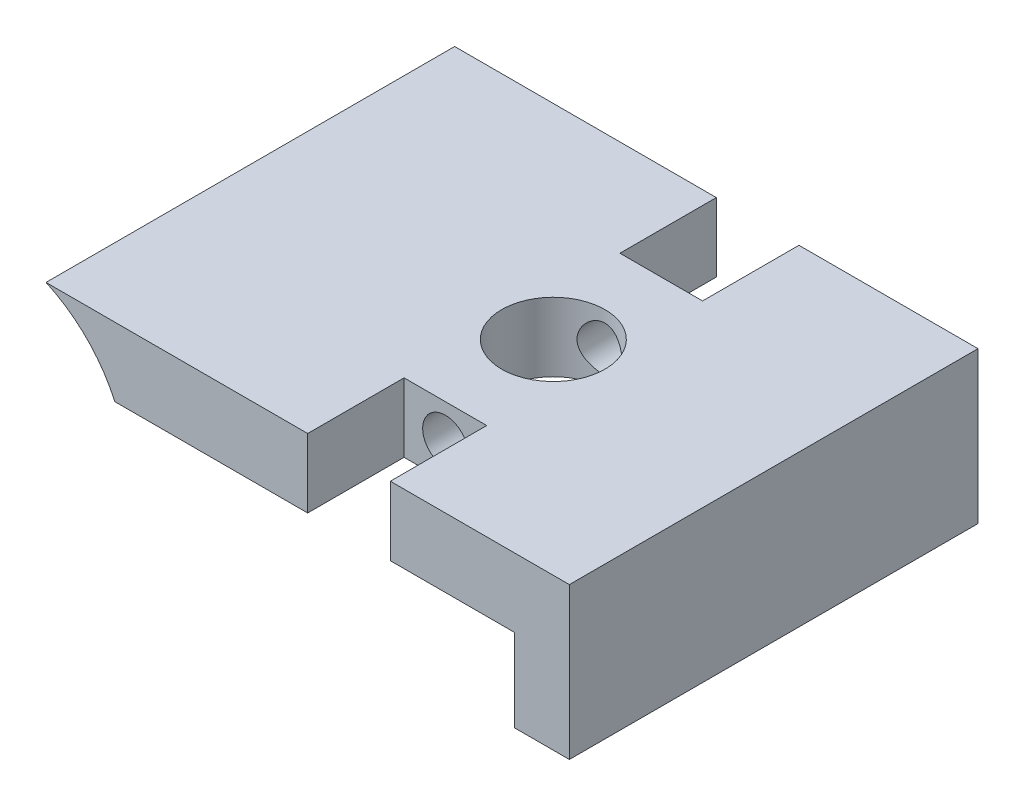
ISO-10303-21;
HEADER;
FILE_DESCRIPTION(('STEP AP214'),'2;1');
FILE_NAME('part.step','',(''),(''),'','','');
FILE_SCHEMA(('AUTOMOTIVE_DESIGN { 1 0 10303 214 1 1 1 1 }'));
ENDSEC;
DATA;
#1=APPLICATION_CONTEXT('core data for automotive mechanical design processes');
#2=APPLICATION_PROTOCOL_DEFINITION('international standard','automotive_design',2000,#1);
#3=PRODUCT_CONTEXT('',#1,'mechanical');
#4=PRODUCT('Part','Part','',(#3));
#5=PRODUCT_RELATED_PRODUCT_CATEGORY('part','',(#4));
#6=PRODUCT_DEFINITION_FORMATION('','',#4);
#7=PRODUCT_DEFINITION_CONTEXT('part definition',#1,'design');
#8=PRODUCT_DEFINITION('design','',#6,#7);
#9=PRODUCT_DEFINITION_SHAPE('','',#8);
#10=(LENGTH_UNIT() NAMED_UNIT(*) SI_UNIT(.MILLI.,.METRE.));
#11=(NAMED_UNIT(*) PLANE_ANGLE_UNIT() SI_UNIT($,.RADIAN.));
#12=(NAMED_UNIT(*) SI_UNIT($,.STERADIAN.) SOLID_ANGLE_UNIT());
#13=UNCERTAINTY_MEASURE_WITH_UNIT(LENGTH_MEASURE(1.E-05),#10,'distance_accuracy_value','');
#14=(GEOMETRIC_REPRESENTATION_CONTEXT(3) GLOBAL_UNCERTAINTY_ASSIGNED_CONTEXT((#13)) GLOBAL_UNIT_ASSIGNED_CONTEXT((#10,
#11,#12)) REPRESENTATION_CONTEXT('',''));
#15=CARTESIAN_POINT('',(0.,0.,0.));
#16=DIRECTION('',(0.,0.,1.));
#17=DIRECTION('',(1.,0.,0.));
#18=AXIS2_PLACEMENT_3D('',#15,#16,#17);
#19=CARTESIAN_POINT('',(3.,0.,-14.836));
#20=DIRECTION('',(0.,0.,1.));
#21=DIRECTION('',(1.,0.,0.));
#22=AXIS2_PLACEMENT_3D('',#19,#20,#21);
#23=CYLINDRICAL_SURFACE('',#22,1.65);
#24=CARTESIAN_POINT('',(4.65,0.,-3.36749164809655));
#25=CARTESIAN_POINT('',(4.64999591948725,-0.0874743691332474,-3.36749607292385));
#26=CARTESIAN_POINT('',(4.64299960015496,-0.175092773934513,-3.37094939684784));
#27=CARTESIAN_POINT('',(4.61531716545798,-0.34775711686567,-3.38429832583538));
#28=CARTESIAN_POINT('',(4.59459592274656,-0.432795867086391,-3.39421046041475));
#29=CARTESIAN_POINT('',(4.54044870220548,-0.597493099250677,-3.41912171212208));
#30=CARTESIAN_POINT('',(4.50707857419381,-0.677173445386291,-3.43409843617774));
#31=CARTESIAN_POINT('',(4.42874832845569,-0.829783884986517,-3.46741736925901));
#32=CARTESIAN_POINT('',(4.38379002894349,-0.902715034980066,-3.48575905018413));
#33=CARTESIAN_POINT('',(4.28021734567749,-1.04487154765316,-3.52516638479344));
#34=CARTESIAN_POINT('',(4.22091990046756,-1.11357209474115,-3.5463309106205));
#35=CARTESIAN_POINT('',(4.09178303274802,-1.240446840094,-3.5881911575404));
#36=CARTESIAN_POINT('',(4.02193928529622,-1.2986166981996,-3.60888668227713));
#37=CARTESIAN_POINT('',(3.86946484491626,-1.4055670834385,-3.64870271327509));
#38=CARTESIAN_POINT('',(3.78637319615618,-1.45374252984987,-3.66769507829857));
#39=CARTESIAN_POINT('',(3.61227632392994,-1.53520034882065,-3.700736202455));
#40=CARTESIAN_POINT('',(3.52127502438019,-1.56849005628031,-3.71478739560396));
#41=CARTESIAN_POINT('',(3.3394662745173,-1.61728382118505,-3.73565913311448));
#42=CARTESIAN_POINT('',(3.24894589824284,-1.63369687425849,-3.74284752867496));
#43=CARTESIAN_POINT('',(3.06617018053507,-1.65122350001049,-3.75052967187645));
#44=CARTESIAN_POINT('',(2.97391564874558,-1.65234404312535,-3.75102646959465));
#45=CARTESIAN_POINT('',(2.79695735459994,-1.63969762210197,-3.74547519866295));
#46=CARTESIAN_POINT('',(2.71216534970809,-1.62693375012661,-3.739868091581));
#47=CARTESIAN_POINT('',(2.5460705321449,-1.58862001141632,-3.72336083389609));
#48=CARTESIAN_POINT('',(2.46476797823857,-1.56306919822084,-3.71246029148675));
#49=CARTESIAN_POINT('',(2.30645273442336,-1.49962622377596,-3.68619520386884));
#50=CARTESIAN_POINT('',(2.22952453920683,-1.46155151512837,-3.67076501619212));
#51=CARTESIAN_POINT('',(2.08294686925941,-1.37433410623967,-3.63691910801703));
#52=CARTESIAN_POINT('',(2.01330005270581,-1.32518738450649,-3.6185023034251));
#53=CARTESIAN_POINT('',(1.87753504589473,-1.2128170119971,-3.57882020061428));
#54=CARTESIAN_POINT('',(1.81210572269681,-1.14879890575555,-3.5574447595915));
#55=CARTESIAN_POINT('',(1.69259260075723,-1.01070787762529,-3.51528240579217));
#56=CARTESIAN_POINT('',(1.63851423294623,-0.936630170451263,-3.49449577883282));
#57=CARTESIAN_POINT('',(1.54117220405855,-0.776800460066403,-3.45502479534648));
#58=CARTESIAN_POINT('',(1.49843008891747,-0.690699088400845,-3.43645839327868));
#59=CARTESIAN_POINT('',(1.42834028609234,-0.511490455495734,-3.40497856582965));
#60=CARTESIAN_POINT('',(1.40098013157646,-0.41838893735563,-3.39206056440346));
#61=CARTESIAN_POINT('',(1.36429227707905,-0.234744535363264,-3.37451456223478));
#62=CARTESIAN_POINT('',(1.35383875555708,-0.144476988157731,-3.36937064835985));
#63=CARTESIAN_POINT('',(1.34792333452705,0.0366498278836368,-3.3664757487194));
#64=CARTESIAN_POINT('',(1.35245516573099,0.127508833402344,-3.36872167133214));
#65=CARTESIAN_POINT('',(1.37535174013094,0.300038323378435,-3.37981562096985));
#66=CARTESIAN_POINT('',(1.39265374352297,0.381886932345066,-3.3881559621082));
#67=CARTESIAN_POINT('',(1.43914744636585,0.541431160999625,-3.40982287754369));
#68=CARTESIAN_POINT('',(1.46834214737761,0.619125726657321,-3.42315071054923));
#69=CARTESIAN_POINT('',(1.53921629690324,0.772027463841041,-3.45400682275722));
#70=CARTESIAN_POINT('',(1.58139272921155,0.846970827739317,-3.47169539316015));
#71=CARTESIAN_POINT('',(1.6765572613445,0.989101543315069,-3.50907546279441));
#72=CARTESIAN_POINT('',(1.72955038819797,1.05628526590526,-3.5287678911715));
#73=CARTESIAN_POINT('',(1.85062358980462,1.1874847750961,-3.57013856276202));
#74=CARTESIAN_POINT('',(1.9196470398001,1.25062896923802,-3.59183160476859));
#75=CARTESIAN_POINT('',(2.06778238636593,1.36462621623266,-3.63309467060809));
#76=CARTESIAN_POINT('',(2.14689558402023,1.41547768147164,-3.65266442003673));
#77=CARTESIAN_POINT('',(2.31400673932617,1.50362813045693,-3.68771558350776));
#78=CARTESIAN_POINT('',(2.40206664806587,1.54082304607771,-3.70316536765515));
#79=CARTESIAN_POINT('',(2.58405684732281,1.59956776607056,-3.72798894821772));
#80=CARTESIAN_POINT('',(2.6779831509097,1.62112807306507,-3.73736682301229));
#81=CARTESIAN_POINT('',(2.8612978165453,1.64656089333973,-3.74847245839303));
#82=CARTESIAN_POINT('',(2.95048512527525,1.65165818539735,-3.75072963755332));
#83=CARTESIAN_POINT('',(3.12843486064658,1.64739798838614,-3.74885512685435));
#84=CARTESIAN_POINT('',(3.21719737386056,1.63804358240264,-3.74472479968784));
#85=CARTESIAN_POINT('',(3.38782932587363,1.60602123171462,-3.7308324127445));
#86=CARTESIAN_POINT('',(3.46983114363675,1.58394115377816,-3.72131934376771));
#87=CARTESIAN_POINT('',(3.62890956243099,1.52777362465028,-3.69776205916142));
#88=CARTESIAN_POINT('',(3.70598528433432,1.49368403723099,-3.68371703743449));
#89=CARTESIAN_POINT('',(3.8569304617613,1.41274147649752,-3.65162935021383));
#90=CARTESIAN_POINT('',(3.93049119711801,1.3653752637279,-3.63343300227536));
#91=CARTESIAN_POINT('',(4.06894266820481,1.2599369507724,-3.59513976322225));
#92=CARTESIAN_POINT('',(4.13382977719906,1.20186039623366,-3.57504208305736));
#93=CARTESIAN_POINT('',(4.25831260974056,1.0713970399496,-3.53324031823005));
#94=CARTESIAN_POINT('',(4.31711532685678,0.998252385431571,-3.51153178279635));
#95=CARTESIAN_POINT('',(4.42177534917193,0.842529476107367,-3.47047923678989));
#96=CARTESIAN_POINT('',(4.46762474174624,0.759945498298501,-3.45113667556083));
#97=CARTESIAN_POINT('',(4.5449162136947,0.587124299309066,-3.41723991894322));
#98=CARTESIAN_POINT('',(4.57632700235197,0.496870953906528,-3.40269614232787));
#99=CARTESIAN_POINT('',(4.62309555077018,0.31164351772581,-3.38064338773551));
#100=CARTESIAN_POINT('',(4.6385071714776,0.216686400884627,-3.3731108155642));
#101=CARTESIAN_POINT('',(4.64703108329939,0.100998496777639,-3.36894448238601));
#102=CARTESIAN_POINT('',(4.64814335262455,0.0808209970433216,-3.36840080987488));
#103=CARTESIAN_POINT('',(4.64962829144477,0.0404315640214764,-3.3676738770119));
#104=CARTESIAN_POINT('',(4.65000094320723,0.02021962992,-3.36749062530128));
#105=CARTESIAN_POINT('',(4.65,0.,-3.36749164809655));
#106=B_SPLINE_CURVE_WITH_KNOTS('',3,(#24,#25,#26,#27,#28,#29,#30,#31,#32,#33,#34,#35,#36,#37,
#38,#39,#40,#41,#42,#43,#44,#45,#46,#47,#48,#49,#50,#51,#52,#53,#54,#55,#56,#57,#58,#59,#60,#61,
#62,#63,#64,#65,#66,#67,#68,#69,#70,#71,#72,#73,#74,#75,#76,#77,#78,#79,#80,#81,#82,#83,#84,#85,
#86,#87,#88,#89,#90,#91,#92,#93,#94,#95,#96,#97,#98,#99,#100,#101,#102,#103,#104,#105),
.UNSPECIFIED.,.T.,.F.,(4,2,2,2,2,2,2,2,2,2,2,2,2,2,2,2,2,2,2,2,2,2,2,2,2,2,2,2,2,2,2,2,2,2,2,2,
2,2,2,2,4),(0.,0.262337992001349,0.52535001551118,0.787214015160152,1.04903695265106,
1.32739302247777,1.60586355517072,1.89807751150631,2.19014732125288,2.46549872058573,
2.74072460857159,2.9973112845901,3.25391695538524,3.51444216606865,3.77506215572741,
4.05582705551463,4.33672598422601,4.62890596840992,4.92084880275994,5.1924046605751,
5.46384692437079,5.71493513596501,5.96608675823259,6.22839495294345,6.49082533337074,
6.77759301230099,7.06439770769602,7.35334470453729,7.64209741960136,7.90880391080322,
8.17545351143564,8.43067328899049,8.68593848747794,8.95289970595717,9.21997220307097,
9.50762420315226,9.79545153931286,10.0838997352209,10.371373694431,10.4320114560409,
10.4926506714452),.UNSPECIFIED.);
#107=CARTESIAN_POINT('',(4.65,0.,-3.36749164809655));
#108=VERTEX_POINT('',#107);
#109=EDGE_CURVE('E189',#108,#108,#106,.T.);
#110=ORIENTED_EDGE('',*,*,#109,.F.);
#111=EDGE_LOOP('',(#110));
#112=FACE_BOUND('',#111,.T.);
#113=CARTESIAN_POINT('',(3.,0.,-7.835));
#114=DIRECTION('',(0.,0.,1.));
#115=DIRECTION('',(1.,0.,0.));
#116=AXIS2_PLACEMENT_3D('',#113,#114,#115);
#117=CIRCLE('',#116,1.65);
#118=CARTESIAN_POINT('',(4.65,0.,-7.835));
#119=VERTEX_POINT('',#118);
#120=EDGE_CURVE('E522',#119,#119,#117,.T.);
#121=ORIENTED_EDGE('',*,*,#120,.F.);
#122=EDGE_LOOP('',(#121));
#123=FACE_BOUND('',#122,.T.);
#124=ADVANCED_FACE('F45',(#112,#123),#23,.F.);
#125=CARTESIAN_POINT('',(3.,-1.65,3.75));
#126=CARTESIAN_POINT('',(3.08794065243915,-1.64999603822561,3.74999677525689));
#127=CARTESIAN_POINT('',(3.17602118872722,-1.64292811014754,3.7468719189208));
#128=CARTESIAN_POINT('',(3.34965330491862,-1.61493414299233,3.734683166008));
#129=CARTESIAN_POINT('',(3.43519818666942,-1.59397431770864,3.72560479056562));
#130=CARTESIAN_POINT('',(3.60097235797527,-1.5391312845056,3.70247374212791));
#131=CARTESIAN_POINT('',(3.68121929706646,-1.505293822675,3.68843868963418));
#132=CARTESIAN_POINT('',(3.83481096834596,-1.42585820871192,3.65674015300381));
#133=CARTESIAN_POINT('',(3.90815735131846,-1.38026287916687,3.63907753990429));
#134=CARTESIAN_POINT('',(4.05000163649842,-1.27598104842036,3.60078615738986));
#135=CARTESIAN_POINT('',(4.11807366426439,-1.21675391782859,3.58005322837619));
#136=CARTESIAN_POINT('',(4.2436925761984,-1.08803679555134,3.53837779505836));
#137=CARTESIAN_POINT('',(4.30123331014303,-1.01854084946946,3.51743517577732));
#138=CARTESIAN_POINT('',(4.40737198125606,-0.866527492524002,3.47638120662905));
#139=CARTESIAN_POINT('',(4.45528386928224,-0.783497192018437,3.45638307676996));
#140=CARTESIAN_POINT('',(4.53627172599083,-0.609555260312117,3.4211597332649));
#141=CARTESIAN_POINT('',(4.56935619199839,-0.518648178890969,3.40593178742375));
#142=CARTESIAN_POINT('',(4.61794121689661,-0.336431274272992,3.3831135312385));
#143=CARTESIAN_POINT('',(4.63426566626132,-0.245387501455808,3.37516767353209));
#144=CARTESIAN_POINT('',(4.65143054751147,-0.0615333461945671,3.3668053594707));
#145=CARTESIAN_POINT('',(4.65228100759649,0.0312758530848424,3.36638402671406));
#146=CARTESIAN_POINT('',(4.63908919688508,0.207355873544219,3.3728210640382));
#147=CARTESIAN_POINT('',(4.6263414186449,0.290751689794494,3.37904671722602));
#148=CARTESIAN_POINT('',(4.58850520692875,0.454071225614267,3.39699646382114));
#149=CARTESIAN_POINT('',(4.56341407162607,0.533994180841886,3.40872176101459));
#150=CARTESIAN_POINT('',(4.50110649630305,0.690226926082278,3.43662073577462));
#151=CARTESIAN_POINT('',(4.46363227970243,0.766416489003947,3.45288773136686));
#152=CARTESIAN_POINT('',(4.37780710670809,0.911743878376031,3.48802159021638));
#153=CARTESIAN_POINT('',(4.32945161231713,0.980878745156235,3.50688953691531));
#154=CARTESIAN_POINT('',(4.21783776896922,1.1170679833526,3.54728261097474));
#155=CARTESIAN_POINT('',(4.15359849475329,1.18329659100235,3.56888963165699));
#156=CARTESIAN_POINT('',(4.01473808953318,1.30433611063186,3.61082599340459));
#157=CARTESIAN_POINT('',(3.94011395212262,1.35914370472459,3.63115496199219));
#158=CARTESIAN_POINT('',(3.7798454417349,1.45719190039968,3.66896451776513));
#159=CARTESIAN_POINT('',(3.69394811565676,1.50005943159355,3.68634771561839));
#160=CARTESIAN_POINT('',(3.51519989197508,1.57043908051859,3.71554130843415));
#161=CARTESIAN_POINT('',(3.42235333017466,1.59796068385571,3.72735514522372));
#162=CARTESIAN_POINT('',(3.23921022750968,1.63505304083377,3.74341295596741));
#163=CARTESIAN_POINT('',(3.14917854061997,1.64572966452197,3.74812228788192));
#164=CARTESIAN_POINT('',(2.96849247665595,1.65217171911425,3.75095455785044));
#165=CARTESIAN_POINT('',(2.87783831540075,1.64794208106068,3.74907967398628));
#166=CARTESIAN_POINT('',(2.70390665287527,1.62544881834208,3.73925037459651));
#167=CARTESIAN_POINT('',(2.62050230959726,1.60799437581934,3.73164663418775));
#168=CARTESIAN_POINT('',(2.45791706209694,1.56071027218963,3.71151728629914));
#169=CARTESIAN_POINT('',(2.37873667607145,1.53087909662229,3.69899107649862));
#170=CARTESIAN_POINT('',(2.22404079862632,1.45873229578337,3.66971134498956));
#171=CARTESIAN_POINT('',(2.14871703627142,1.41605581574277,3.65283800179973));
#172=CARTESIAN_POINT('',(2.00602810222664,1.31982329381418,3.61662102234894));
#173=CARTESIAN_POINT('',(1.93866640117435,1.26626253496257,3.5972763164179));
#174=CARTESIAN_POINT('',(1.80819611837274,1.14484038573232,3.55628214760163));
#175=CARTESIAN_POINT('',(1.74584598439285,1.07618271743489,3.53457144282308));
#176=CARTESIAN_POINT('',(1.63330445356359,0.929097206857131,3.49260064747062));
#177=CARTESIAN_POINT('',(1.58311709508679,0.850666132592151,3.47234104026915));
#178=CARTESIAN_POINT('',(1.49540307748589,0.683921591275962,3.43526035744154));
#179=CARTESIAN_POINT('',(1.45817723591055,0.595429542818637,3.4185241503665));
#180=CARTESIAN_POINT('',(1.39950438017547,0.412456963898668,3.39145640297362));
#181=CARTESIAN_POINT('',(1.37804232181517,0.31798223681692,3.38111875766089));
#182=CARTESIAN_POINT('',(1.35307874998712,0.134229339541118,3.36902436868046));
#183=CARTESIAN_POINT('',(1.34822601990919,0.0451768053067855,3.36662264808986));
#184=CARTESIAN_POINT('',(1.35292803694661,-0.132443324028021,3.36892598901368));
#185=CARTESIAN_POINT('',(1.36247987258739,-0.221011013494953,3.37362961438419));
#186=CARTESIAN_POINT('',(1.39454415171674,-0.389834130472385,3.38899632048545));
#187=CARTESIAN_POINT('',(1.41627535473376,-0.470274087988891,3.39929913530276));
#188=CARTESIAN_POINT('',(1.4712672768033,-0.626361280798593,3.42438089295876));
#189=CARTESIAN_POINT('',(1.50453131275969,-0.702007129869672,3.43916112337134));
#190=CARTESIAN_POINT('',(1.58406507679427,-0.851619735953305,3.47269356886383));
#191=CARTESIAN_POINT('',(1.63102681157857,-0.925174495154697,3.49163847278619));
#192=CARTESIAN_POINT('',(1.7357127896172,-1.06377992281056,3.53089238653571));
#193=CARTESIAN_POINT('',(1.79344141213049,-1.12882711256769,3.55120194925799));
#194=CARTESIAN_POINT('',(1.92382903951875,-1.25428003578287,3.59296880703805));
#195=CARTESIAN_POINT('',(1.99734015606778,-1.31382091586417,3.6143768693599));
#196=CARTESIAN_POINT('',(2.15406955877593,-1.41980560454866,3.65423468677977));
#197=CARTESIAN_POINT('',(2.23729223810855,-1.46624345307615,3.67268309400139));
#198=CARTESIAN_POINT('',(2.41023740744422,-1.54387701756614,3.70436408768263));
#199=CARTESIAN_POINT('',(2.49986734754799,-1.57525320509647,3.71765804406783));
#200=CARTESIAN_POINT('',(2.68371482188615,-1.62216171678277,3.73777368374933));
#201=CARTESIAN_POINT('',(2.77791736039553,-1.63774259010252,3.74461519501638));
#202=CARTESIAN_POINT('',(2.89387606102141,-1.64672172070879,3.7485588513459));
#203=CARTESIAN_POINT('',(2.91507632147087,-1.64794995964319,3.74909837906909));
#204=CARTESIAN_POINT('',(2.95751499929637,-1.64958958196251,3.74981934473969));
#205=CARTESIAN_POINT('',(2.97875341705226,-1.65000095717016,3.75000077910238));
#206=CARTESIAN_POINT('',(3.,-1.65,3.75));
#207=B_SPLINE_CURVE_WITH_KNOTS('',3,(#125,#126,#127,#128,#129,#130,#131,#132,#133,#134,#135,
#136,#137,#138,#139,#140,#141,#142,#143,#144,#145,#146,#147,#148,#149,#150,#151,#152,#153,#154,
#155,#156,#157,#158,#159,#160,#161,#162,#163,#164,#165,#166,#167,#168,#169,#170,#171,#172,#173,
#174,#175,#176,#177,#178,#179,#180,#181,#182,#183,#184,#185,#186,#187,#188,#189,#190,#191,#192,
#193,#194,#195,#196,#197,#198,#199,#200,#201,#202,#203,#204,#205,#206),.UNSPECIFIED.,.T.,.F.,(4,
2,2,2,2,2,2,2,2,2,2,2,2,2,2,2,2,2,2,2,2,2,2,2,2,2,2,2,2,2,2,2,2,2,2,2,2,2,2,2,4),(0.,
0.263734510147988,0.52811280905045,0.791560575603074,1.05494515780487,1.33150079465859,
1.60821742685178,1.90051649596435,2.19264783893791,2.46960925800041,2.74639118079142,
2.99899429642278,3.25165272874969,3.50994222706956,3.76833964437948,4.05135561937526,
4.33445369828947,4.62559874662744,4.91656363268483,5.18748705235547,5.45832085804592,
5.71380105020368,5.96931251303604,6.23280504553125,6.49641201330446,6.78088013255853,
7.06544257396593,7.35622693243307,7.64673341835486,7.91295937269032,8.17913152420861,
8.42991502344918,8.68077070926696,8.94756356427704,9.21446517058845,9.50405959505639,
9.79378553355286,10.0799474542432,10.3652271238324,10.4289451074685,10.4926637289549),.UNSPECIFIED.);
#208=CARTESIAN_POINT('',(3.,-1.65,3.75));
#209=VERTEX_POINT('',#208);
#210=EDGE_CURVE('E198',#209,#209,#207,.T.);
#211=ORIENTED_EDGE('',*,*,#210,.F.);
#212=EDGE_LOOP('',(#211));
#213=FACE_BOUND('',#212,.T.);
#214=CARTESIAN_POINT('',(3.,0.,7.835));
#215=DIRECTION('',(0.,0.,1.));
#216=DIRECTION('',(1.,0.,0.));
#217=AXIS2_PLACEMENT_3D('',#214,#215,#216);
#218=CIRCLE('',#217,1.65);
#219=CARTESIAN_POINT('',(4.65,0.,7.835));
#220=VERTEX_POINT('',#219);
#221=EDGE_CURVE('E482',#220,#220,#218,.T.);
#222=ORIENTED_EDGE('',*,*,#221,.T.);
#223=EDGE_LOOP('',(#222));
#224=FACE_BOUND('',#223,.T.);
#225=ADVANCED_FACE('F215',(#213,#224),#23,.F.);
#226=CARTESIAN_POINT('',(-19.,2.5,14.835));
#227=DIRECTION('',(0.,-1.,0.));
#228=DIRECTION('',(1.,0.,0.));
#229=AXIS2_PLACEMENT_3D('',#226,#227,#228);
#230=PLANE('',#229);
#231=CARTESIAN_POINT('',(3.,2.5,0.));
#232=DIRECTION('',(0.,1.,0.));
#233=DIRECTION('',(0.,0.,1.));
#234=AXIS2_PLACEMENT_3D('',#231,#232,#233);
#235=CIRCLE('',#234,3.75);
#236=CARTESIAN_POINT('',(3.,2.5,3.75));
#237=VERTEX_POINT('',#236);
#238=EDGE_CURVE('E181',#237,#237,#235,.T.);
#239=ORIENTED_EDGE('',*,*,#238,.F.);
#240=EDGE_LOOP('',(#239));
#241=FACE_BOUND('',#240,.T.);
#242=DIRECTION('',(0.,0.,-1.));
#243=VECTOR('',#242,1.);
#244=CARTESIAN_POINT('',(0.,2.5,-7.835));
#245=LINE('',#244,#243);
#246=CARTESIAN_POINT('',(0.,2.5,-7.835));
#247=VERTEX_POINT('',#246);
#248=CARTESIAN_POINT('',(0.,2.5,-14.835));
#249=VERTEX_POINT('',#248);
#250=EDGE_CURVE('E255',#247,#249,#245,.T.);
#251=ORIENTED_EDGE('',*,*,#250,.T.);
#252=DIRECTION('',(-1.,0.,0.));
#253=VECTOR('',#252,1.);
#254=CARTESIAN_POINT('',(-19.,2.5,-14.835));
#255=LINE('',#254,#253);
#256=CARTESIAN_POINT('',(-19.,2.5,-14.835));
#257=VERTEX_POINT('',#256);
#258=EDGE_CURVE('E258',#249,#257,#255,.T.);
#259=ORIENTED_EDGE('',*,*,#258,.T.);
#260=DIRECTION('',(0.,0.,-1.));
#261=VECTOR('',#260,1.);
#262=CARTESIAN_POINT('',(-19.,2.5,14.835));
#263=LINE('',#262,#261);
#264=CARTESIAN_POINT('',(-19.,2.5,14.835));
#265=VERTEX_POINT('',#264);
#266=EDGE_CURVE('E54',#265,#257,#263,.T.);
#267=ORIENTED_EDGE('',*,*,#266,.F.);
#268=DIRECTION('',(-1.,0.,0.));
#269=VECTOR('',#268,1.);
#270=CARTESIAN_POINT('',(-19.,2.5,14.835));
#271=LINE('',#270,#269);
#272=CARTESIAN_POINT('',(0.,2.5,14.835));
#273=VERTEX_POINT('',#272);
#274=EDGE_CURVE('E301',#273,#265,#271,.T.);
#275=ORIENTED_EDGE('',*,*,#274,.F.);
#276=DIRECTION('',(0.,0.,1.));
#277=VECTOR('',#276,1.);
#278=CARTESIAN_POINT('',(0.,2.5,7.835));
#279=LINE('',#278,#277);
#280=CARTESIAN_POINT('',(0.,2.5,7.835));
#281=VERTEX_POINT('',#280);
#282=EDGE_CURVE('E280',#281,#273,#279,.T.);
#283=ORIENTED_EDGE('',*,*,#282,.F.);
#284=DIRECTION('',(-1.,0.,0.));
#285=VECTOR('',#284,1.);
#286=CARTESIAN_POINT('',(6.,2.5,7.835));
#287=LINE('',#286,#285);
#288=CARTESIAN_POINT('',(6.,2.5,7.835));
#289=VERTEX_POINT('',#288);
#290=EDGE_CURVE('E487',#289,#281,#287,.T.);
#291=ORIENTED_EDGE('',*,*,#290,.F.);
#292=DIRECTION('',(0.,0.,1.));
#293=VECTOR('',#292,1.);
#294=CARTESIAN_POINT('',(6.,2.5,7.835));
#295=LINE('',#294,#293);
#296=CARTESIAN_POINT('',(6.,2.5,14.835));
#297=VERTEX_POINT('',#296);
#298=EDGE_CURVE('E490',#289,#297,#295,.T.);
#299=ORIENTED_EDGE('',*,*,#298,.T.);
#300=CARTESIAN_POINT('',(19.,2.5,14.835));
#301=VERTEX_POINT('',#300);
#302=EDGE_CURVE('E306',#301,#297,#271,.T.);
#303=ORIENTED_EDGE('',*,*,#302,.F.);
#304=DIRECTION('',(0.,0.,-1.));
#305=VECTOR('',#304,1.);
#306=CARTESIAN_POINT('',(19.,2.5,14.835));
#307=LINE('',#306,#305);
#308=CARTESIAN_POINT('',(19.,2.5,-14.835));
#309=VERTEX_POINT('',#308);
#310=EDGE_CURVE('E11',#301,#309,#307,.T.);
#311=ORIENTED_EDGE('',*,*,#310,.T.);
#312=CARTESIAN_POINT('',(6.,2.5,-14.835));
#313=VERTEX_POINT('',#312);
#314=EDGE_CURVE('E275',#309,#313,#255,.T.);
#315=ORIENTED_EDGE('',*,*,#314,.T.);
#316=DIRECTION('',(0.,0.,-1.));
#317=VECTOR('',#316,1.);
#318=CARTESIAN_POINT('',(6.,2.5,-7.835));
#319=LINE('',#318,#317);
#320=CARTESIAN_POINT('',(6.,2.5,-7.835));
#321=VERTEX_POINT('',#320);
#322=EDGE_CURVE('E69',#321,#313,#319,.T.);
#323=ORIENTED_EDGE('',*,*,#322,.F.);
#324=DIRECTION('',(-1.,0.,0.));
#325=VECTOR('',#324,1.);
#326=CARTESIAN_POINT('',(6.,2.5,-7.835));
#327=LINE('',#326,#325);
#328=EDGE_CURVE('E261',#321,#247,#327,.T.);
#329=ORIENTED_EDGE('',*,*,#328,.T.);
#330=EDGE_LOOP('',(#251,#259,#267,#275,#283,#291,#299,#303,#311,#315,#323,#329));
#331=FACE_BOUND('',#330,.T.);
#332=ADVANCED_FACE('F222',(#241,#331),#230,.F.);
#333=CARTESIAN_POINT('',(-14.,-2.5,14.835));
#334=DIRECTION('',(0.,1.,0.));
#335=DIRECTION('',(0.,0.,1.));
#336=AXIS2_PLACEMENT_3D('',#333,#334,#335);
#337=PLANE('',#336);
#338=CARTESIAN_POINT('',(3.,-2.5,0.));
#339=DIRECTION('',(0.,1.,0.));
#340=DIRECTION('',(0.,0.,1.));
#341=AXIS2_PLACEMENT_3D('',#338,#339,#340);
#342=CIRCLE('',#341,3.75);
#343=CARTESIAN_POINT('',(3.,-2.5,3.75));
#344=VERTEX_POINT('',#343);
#345=EDGE_CURVE('E185',#344,#344,#342,.F.);
#346=ORIENTED_EDGE('',*,*,#345,.F.);
#347=EDGE_LOOP('',(#346));
#348=FACE_BOUND('',#347,.T.);
#349=DIRECTION('',(1.,0.,0.));
#350=VECTOR('',#349,1.);
#351=CARTESIAN_POINT('',(-14.,-2.5,-14.835));
#352=LINE('',#351,#350);
#353=CARTESIAN_POINT('',(6.,-2.5,-14.835));
#354=VERTEX_POINT('',#353);
#355=CARTESIAN_POINT('',(15.,-2.5,-14.835));
#356=VERTEX_POINT('',#355);
#357=EDGE_CURVE('E286',#354,#356,#352,.T.);
#358=ORIENTED_EDGE('',*,*,#357,.T.);
#359=DIRECTION('',(0.,0.,1.));
#360=VECTOR('',#359,1.);
#361=CARTESIAN_POINT('',(15.,-2.5,-22.046102550928));
#362=LINE('',#361,#360);
#363=CARTESIAN_POINT('',(15.,-2.5,14.835));
#364=VERTEX_POINT('',#363);
#365=EDGE_CURVE('E169',#356,#364,#362,.T.);
#366=ORIENTED_EDGE('',*,*,#365,.T.);
#367=DIRECTION('',(1.,0.,0.));
#368=VECTOR('',#367,1.);
#369=CARTESIAN_POINT('',(-14.,-2.5,14.835));
#370=LINE('',#369,#368);
#371=CARTESIAN_POINT('',(6.,-2.5,14.835));
#372=VERTEX_POINT('',#371);
#373=EDGE_CURVE('E316',#372,#364,#370,.T.);
#374=ORIENTED_EDGE('',*,*,#373,.F.);
#375=DIRECTION('',(0.,0.,1.));
#376=VECTOR('',#375,1.);
#377=CARTESIAN_POINT('',(6.,-2.5,7.835));
#378=LINE('',#377,#376);
#379=CARTESIAN_POINT('',(6.,-2.5,7.835));
#380=VERTEX_POINT('',#379);
#381=EDGE_CURVE('E328',#380,#372,#378,.T.);
#382=ORIENTED_EDGE('',*,*,#381,.F.);
#383=DIRECTION('',(1.,0.,0.));
#384=VECTOR('',#383,1.);
#385=CARTESIAN_POINT('',(6.,-2.5,7.835));
#386=LINE('',#385,#384);
#387=CARTESIAN_POINT('',(0.,-2.5,7.835));
#388=VERTEX_POINT('',#387);
#389=EDGE_CURVE('E485',#388,#380,#386,.T.);
#390=ORIENTED_EDGE('',*,*,#389,.F.);
#391=DIRECTION('',(0.,0.,1.));
#392=VECTOR('',#391,1.);
#393=CARTESIAN_POINT('',(0.,-2.5,7.835));
#394=LINE('',#393,#392);
#395=CARTESIAN_POINT('',(0.,-2.5,14.835));
#396=VERTEX_POINT('',#395);
#397=EDGE_CURVE('E479',#388,#396,#394,.T.);
#398=ORIENTED_EDGE('',*,*,#397,.T.);
#399=CARTESIAN_POINT('',(-14.,-2.5,14.835));
#400=VERTEX_POINT('',#399);
#401=EDGE_CURVE('E294',#400,#396,#370,.T.);
#402=ORIENTED_EDGE('',*,*,#401,.F.);
#403=DIRECTION('',(0.,0.,-1.));
#404=VECTOR('',#403,1.);
#405=CARTESIAN_POINT('',(-14.,-2.5,14.835));
#406=LINE('',#405,#404);
#407=CARTESIAN_POINT('',(-14.,-2.5,-14.835));
#408=VERTEX_POINT('',#407);
#409=EDGE_CURVE('E291',#400,#408,#406,.T.);
#410=ORIENTED_EDGE('',*,*,#409,.T.);
#411=CARTESIAN_POINT('',(0.,-2.5,-14.835));
#412=VERTEX_POINT('',#411);
#413=EDGE_CURVE('E287',#408,#412,#352,.T.);
#414=ORIENTED_EDGE('',*,*,#413,.T.);
#415=DIRECTION('',(0.,0.,-1.));
#416=VECTOR('',#415,1.);
#417=CARTESIAN_POINT('',(0.,-2.5,-7.835));
#418=LINE('',#417,#416);
#419=CARTESIAN_POINT('',(0.,-2.5,-7.835));
#420=VERTEX_POINT('',#419);
#421=EDGE_CURVE('E512',#420,#412,#418,.T.);
#422=ORIENTED_EDGE('',*,*,#421,.F.);
#423=DIRECTION('',(1.,0.,0.));
#424=VECTOR('',#423,1.);
#425=CARTESIAN_POINT('',(6.,-2.5,-7.835));
#426=LINE('',#425,#424);
#427=CARTESIAN_POINT('',(6.,-2.5,-7.835));
#428=VERTEX_POINT('',#427);
#429=EDGE_CURVE('E266',#420,#428,#426,.T.);
#430=ORIENTED_EDGE('',*,*,#429,.T.);
#431=DIRECTION('',(0.,0.,-1.));
#432=VECTOR('',#431,1.);
#433=CARTESIAN_POINT('',(6.,-2.5,-7.835));
#434=LINE('',#433,#432);
#435=EDGE_CURVE('E331',#428,#354,#434,.T.);
#436=ORIENTED_EDGE('',*,*,#435,.T.);
#437=EDGE_LOOP('',(#358,#366,#374,#382,#390,#398,#402,#410,#414,#422,#430,#436));
#438=FACE_BOUND('',#437,.T.);
#439=ADVANCED_FACE('F239',(#348,#438),#337,.F.);
#440=CARTESIAN_POINT('',(-23.1143782776615,-6.61437827766147,-14.835));
#441=DIRECTION('',(0.,0.,-1.));
#442=DIRECTION('',(-1.,0.,0.));
#443=AXIS2_PLACEMENT_3D('',#440,#441,#442);
#444=PLANE('',#443);
#445=ORIENTED_EDGE('',*,*,#258,.F.);
#446=DIRECTION('',(0.,-1.,0.));
#447=VECTOR('',#446,1.);
#448=CARTESIAN_POINT('',(0.,-2.5,-14.835));
#449=LINE('',#448,#447);
#450=EDGE_CURVE('E271',#249,#412,#449,.T.);
#451=ORIENTED_EDGE('',*,*,#450,.T.);
#452=ORIENTED_EDGE('',*,*,#413,.F.);
#453=CARTESIAN_POINT('',(-23.1143782776615,-6.61437827766147,-14.835));
#454=DIRECTION('',(0.,0.,-1.));
#455=DIRECTION('',(-1.,0.,0.));
#456=AXIS2_PLACEMENT_3D('',#453,#454,#455);
#457=CIRCLE('',#456,10.);
#458=EDGE_CURVE('E273',#257,#408,#457,.T.);
#459=ORIENTED_EDGE('',*,*,#458,.F.);
#460=EDGE_LOOP('',(#445,#451,#452,#459));
#461=FACE_BOUND('',#460,.T.);
#462=ADVANCED_FACE('F236',(#461),#444,.T.);
#463=ORIENTED_EDGE('',*,*,#357,.F.);
#464=DIRECTION('',(0.,1.,0.));
#465=VECTOR('',#464,1.);
#466=CARTESIAN_POINT('',(6.,-2.5,-14.835));
#467=LINE('',#466,#465);
#468=EDGE_CURVE('E333',#354,#313,#467,.T.);
#469=ORIENTED_EDGE('',*,*,#468,.T.);
#470=ORIENTED_EDGE('',*,*,#314,.F.);
#471=DIRECTION('',(0.,1.,0.));
#472=VECTOR('',#471,1.);
#473=CARTESIAN_POINT('',(19.,-2.5,-14.835));
#474=LINE('',#473,#472);
#475=CARTESIAN_POINT('',(19.,-8.5,-14.835));
#476=VERTEX_POINT('',#475);
#477=EDGE_CURVE('E154',#476,#309,#474,.T.);
#478=ORIENTED_EDGE('',*,*,#477,.F.);
#479=DIRECTION('',(1.,0.,0.));
#480=VECTOR('',#479,1.);
#481=CARTESIAN_POINT('',(19.,-8.5,-14.835));
#482=LINE('',#481,#480);
#483=CARTESIAN_POINT('',(15.,-8.5,-14.835));
#484=VERTEX_POINT('',#483);
#485=EDGE_CURVE('E147',#484,#476,#482,.T.);
#486=ORIENTED_EDGE('',*,*,#485,.F.);
#487=DIRECTION('',(0.,-1.,0.));
#488=VECTOR('',#487,1.);
#489=CARTESIAN_POINT('',(15.,-8.5,-14.835));
#490=LINE('',#489,#488);
#491=EDGE_CURVE('E152',#356,#484,#490,.T.);
#492=ORIENTED_EDGE('',*,*,#491,.F.);
#493=EDGE_LOOP('',(#463,#469,#470,#478,#486,#492));
#494=FACE_BOUND('',#493,.T.);
#495=ADVANCED_FACE('F150',(#494),#444,.T.);
#496=CARTESIAN_POINT('',(-23.1143782776615,-6.61437827766147,14.835));
#497=DIRECTION('',(0.,0.,-1.));
#498=DIRECTION('',(-1.,0.,0.));
#499=AXIS2_PLACEMENT_3D('',#496,#497,#498);
#500=PLANE('',#499);
#501=ORIENTED_EDGE('',*,*,#401,.T.);
#502=DIRECTION('',(0.,-1.,0.));
#503=VECTOR('',#502,1.);
#504=CARTESIAN_POINT('',(0.,-2.5,14.835));
#505=LINE('',#504,#503);
#506=EDGE_CURVE('E477',#273,#396,#505,.T.);
#507=ORIENTED_EDGE('',*,*,#506,.F.);
#508=ORIENTED_EDGE('',*,*,#274,.T.);
#509=CARTESIAN_POINT('',(-23.1143782776615,-6.61437827766147,14.835));
#510=DIRECTION('',(0.,0.,-1.));
#511=DIRECTION('',(-1.,0.,0.));
#512=AXIS2_PLACEMENT_3D('',#509,#510,#511);
#513=CIRCLE('',#512,10.);
#514=EDGE_CURVE('E298',#265,#400,#513,.T.);
#515=ORIENTED_EDGE('',*,*,#514,.T.);
#516=EDGE_LOOP('',(#501,#507,#508,#515));
#517=FACE_BOUND('',#516,.T.);
#518=ADVANCED_FACE('F235',(#517),#500,.F.);
#519=CARTESIAN_POINT('',(19.,-2.5,14.835));
#520=DIRECTION('',(-1.,0.,0.));
#521=DIRECTION('',(0.,0.,1.));
#522=AXIS2_PLACEMENT_3D('',#519,#520,#521);
#523=PLANE('',#522);
#524=ORIENTED_EDGE('',*,*,#477,.T.);
#525=ORIENTED_EDGE('',*,*,#310,.F.);
#526=DIRECTION('',(0.,1.,0.));
#527=VECTOR('',#526,1.);
#528=CARTESIAN_POINT('',(19.,-2.5,14.835));
#529=LINE('',#528,#527);
#530=CARTESIAN_POINT('',(19.,-8.5,14.835));
#531=VERTEX_POINT('',#530);
#532=EDGE_CURVE('E290',#531,#301,#529,.T.);
#533=ORIENTED_EDGE('',*,*,#532,.F.);
#534=DIRECTION('',(0.,0.,1.));
#535=VECTOR('',#534,1.);
#536=CARTESIAN_POINT('',(19.,-8.5,-22.046102550928));
#537=LINE('',#536,#535);
#538=EDGE_CURVE('E159',#476,#531,#537,.T.);
#539=ORIENTED_EDGE('',*,*,#538,.F.);
#540=EDGE_LOOP('',(#524,#525,#533,#539));
#541=FACE_BOUND('',#540,.T.);
#542=ADVANCED_FACE('F47',(#541),#523,.F.);
#543=CARTESIAN_POINT('',(-23.1143782776615,-6.61437827766147,14.835));
#544=DIRECTION('',(0.,0.,-1.));
#545=DIRECTION('',(-1.,0.,0.));
#546=AXIS2_PLACEMENT_3D('',#543,#544,#545);
#547=CYLINDRICAL_SURFACE('',#546,10.);
#548=ORIENTED_EDGE('',*,*,#458,.T.);
#549=ORIENTED_EDGE('',*,*,#409,.F.);
#550=ORIENTED_EDGE('',*,*,#514,.F.);
#551=ORIENTED_EDGE('',*,*,#266,.T.);
#552=EDGE_LOOP('',(#548,#549,#550,#551));
#553=FACE_BOUND('',#552,.T.);
#554=ADVANCED_FACE('F233',(#553),#547,.F.);
#555=ORIENTED_EDGE('',*,*,#302,.T.);
#556=DIRECTION('',(0.,1.,0.));
#557=VECTOR('',#556,1.);
#558=CARTESIAN_POINT('',(6.,-2.5,14.835));
#559=LINE('',#558,#557);
#560=EDGE_CURVE('E324',#372,#297,#559,.T.);
#561=ORIENTED_EDGE('',*,*,#560,.F.);
#562=ORIENTED_EDGE('',*,*,#373,.T.);
#563=DIRECTION('',(0.,-1.,0.));
#564=VECTOR('',#563,1.);
#565=CARTESIAN_POINT('',(15.,-8.5,14.835));
#566=LINE('',#565,#564);
#567=CARTESIAN_POINT('',(15.,-8.5,14.835));
#568=VERTEX_POINT('',#567);
#569=EDGE_CURVE('E61',#364,#568,#566,.T.);
#570=ORIENTED_EDGE('',*,*,#569,.T.);
#571=DIRECTION('',(1.,0.,0.));
#572=VECTOR('',#571,1.);
#573=CARTESIAN_POINT('',(19.,-8.5,14.835));
#574=LINE('',#573,#572);
#575=EDGE_CURVE('E165',#568,#531,#574,.T.);
#576=ORIENTED_EDGE('',*,*,#575,.T.);
#577=ORIENTED_EDGE('',*,*,#532,.T.);
#578=EDGE_LOOP('',(#555,#561,#562,#570,#576,#577));
#579=FACE_BOUND('',#578,.T.);
#580=ADVANCED_FACE('F230',(#579),#500,.F.);
#581=CARTESIAN_POINT('',(0.,-2.5,7.835));
#582=DIRECTION('',(-1.,0.,0.));
#583=DIRECTION('',(0.,0.,1.));
#584=AXIS2_PLACEMENT_3D('',#581,#582,#583);
#585=PLANE('',#584);
#586=ORIENTED_EDGE('',*,*,#506,.T.);
#587=ORIENTED_EDGE('',*,*,#397,.F.);
#588=DIRECTION('',(0.,-1.,0.));
#589=VECTOR('',#588,1.);
#590=CARTESIAN_POINT('',(0.,-2.5,7.835));
#591=LINE('',#590,#589);
#592=EDGE_CURVE('E501',#281,#388,#591,.T.);
#593=ORIENTED_EDGE('',*,*,#592,.F.);
#594=ORIENTED_EDGE('',*,*,#282,.T.);
#595=EDGE_LOOP('',(#586,#587,#593,#594));
#596=FACE_BOUND('',#595,.T.);
#597=ADVANCED_FACE('F228',(#596),#585,.F.);
#598=CARTESIAN_POINT('',(6.,-2.5,7.835));
#599=DIRECTION('',(1.,0.,0.));
#600=DIRECTION('',(0.,0.,-1.));
#601=AXIS2_PLACEMENT_3D('',#598,#599,#600);
#602=PLANE('',#601);
#603=ORIENTED_EDGE('',*,*,#560,.T.);
#604=ORIENTED_EDGE('',*,*,#298,.F.);
#605=DIRECTION('',(0.,1.,0.));
#606=VECTOR('',#605,1.);
#607=CARTESIAN_POINT('',(6.,-2.5,7.835));
#608=LINE('',#607,#606);
#609=EDGE_CURVE('E493',#380,#289,#608,.T.);
#610=ORIENTED_EDGE('',*,*,#609,.F.);
#611=ORIENTED_EDGE('',*,*,#381,.T.);
#612=EDGE_LOOP('',(#603,#604,#610,#611));
#613=FACE_BOUND('',#612,.T.);
#614=ADVANCED_FACE('F423',(#613),#602,.F.);
#615=CARTESIAN_POINT('',(0.,0.,7.835));
#616=DIRECTION('',(0.,0.,1.));
#617=DIRECTION('',(1.,0.,0.));
#618=AXIS2_PLACEMENT_3D('',#615,#616,#617);
#619=PLANE('',#618);
#620=ORIENTED_EDGE('',*,*,#221,.F.);
#621=EDGE_LOOP('',(#620));
#622=FACE_BOUND('',#621,.T.);
#623=ORIENTED_EDGE('',*,*,#592,.T.);
#624=ORIENTED_EDGE('',*,*,#389,.T.);
#625=ORIENTED_EDGE('',*,*,#609,.T.);
#626=ORIENTED_EDGE('',*,*,#290,.T.);
#627=EDGE_LOOP('',(#623,#624,#625,#626));
#628=FACE_BOUND('',#627,.T.);
#629=ADVANCED_FACE('F394',(#622,#628),#619,.T.);
#630=CARTESIAN_POINT('',(0.,0.,-7.835));
#631=DIRECTION('',(0.,0.,-1.));
#632=DIRECTION('',(1.,0.,0.));
#633=AXIS2_PLACEMENT_3D('',#630,#631,#632);
#634=PLANE('',#633);
#635=DIRECTION('',(0.,-1.,0.));
#636=VECTOR('',#635,1.);
#637=CARTESIAN_POINT('',(0.,-2.5,-7.835));
#638=LINE('',#637,#636);
#639=EDGE_CURVE('E335',#247,#420,#638,.T.);
#640=ORIENTED_EDGE('',*,*,#639,.F.);
#641=ORIENTED_EDGE('',*,*,#328,.F.);
#642=DIRECTION('',(0.,1.,0.));
#643=VECTOR('',#642,1.);
#644=CARTESIAN_POINT('',(6.,-2.5,-7.835));
#645=LINE('',#644,#643);
#646=EDGE_CURVE('E525',#428,#321,#645,.T.);
#647=ORIENTED_EDGE('',*,*,#646,.F.);
#648=ORIENTED_EDGE('',*,*,#429,.F.);
#649=EDGE_LOOP('',(#640,#641,#647,#648));
#650=FACE_BOUND('',#649,.T.);
#651=ORIENTED_EDGE('',*,*,#120,.T.);
#652=EDGE_LOOP('',(#651));
#653=FACE_BOUND('',#652,.T.);
#654=ADVANCED_FACE('F385',(#650,#653),#634,.T.);
#655=CARTESIAN_POINT('',(0.,-2.5,-7.835));
#656=DIRECTION('',(1.,0.,0.));
#657=DIRECTION('',(0.,0.,-1.));
#658=AXIS2_PLACEMENT_3D('',#655,#656,#657);
#659=PLANE('',#658);
#660=ORIENTED_EDGE('',*,*,#450,.F.);
#661=ORIENTED_EDGE('',*,*,#250,.F.);
#662=ORIENTED_EDGE('',*,*,#639,.T.);
#663=ORIENTED_EDGE('',*,*,#421,.T.);
#664=EDGE_LOOP('',(#660,#661,#662,#663));
#665=FACE_BOUND('',#664,.T.);
#666=ADVANCED_FACE('F376',(#665),#659,.T.);
#667=CARTESIAN_POINT('',(6.,-2.5,-7.835));
#668=DIRECTION('',(-1.,0.,0.));
#669=DIRECTION('',(0.,0.,1.));
#670=AXIS2_PLACEMENT_3D('',#667,#668,#669);
#671=PLANE('',#670);
#672=ORIENTED_EDGE('',*,*,#468,.F.);
#673=ORIENTED_EDGE('',*,*,#435,.F.);
#674=ORIENTED_EDGE('',*,*,#646,.T.);
#675=ORIENTED_EDGE('',*,*,#322,.T.);
#676=EDGE_LOOP('',(#672,#673,#674,#675));
#677=FACE_BOUND('',#676,.T.);
#678=ADVANCED_FACE('F360',(#677),#671,.T.);
#679=CARTESIAN_POINT('',(3.,-2.501,0.));
#680=DIRECTION('',(0.,1.,0.));
#681=DIRECTION('',(0.,0.,1.));
#682=AXIS2_PLACEMENT_3D('',#679,#680,#681);
#683=CYLINDRICAL_SURFACE('',#682,3.75);
#684=ORIENTED_EDGE('',*,*,#238,.T.);
#685=EDGE_LOOP('',(#684));
#686=FACE_BOUND('',#685,.T.);
#687=ORIENTED_EDGE('',*,*,#345,.T.);
#688=EDGE_LOOP('',(#687));
#689=FACE_BOUND('',#688,.T.);
#690=ORIENTED_EDGE('',*,*,#109,.T.);
#691=EDGE_LOOP('',(#690));
#692=FACE_BOUND('',#691,.T.);
#693=ORIENTED_EDGE('',*,*,#210,.T.);
#694=EDGE_LOOP('',(#693));
#695=FACE_BOUND('',#694,.T.);
#696=ADVANCED_FACE('F203',(#686,#689,#692,#695),#683,.F.);
#697=CARTESIAN_POINT('',(15.,-8.5,-22.046102550928));
#698=DIRECTION('',(-1.,0.,0.));
#699=DIRECTION('',(0.,-1.,0.));
#700=AXIS2_PLACEMENT_3D('',#697,#698,#699);
#701=PLANE('',#700);
#702=ORIENTED_EDGE('',*,*,#365,.F.);
#703=ORIENTED_EDGE('',*,*,#491,.T.);
#704=DIRECTION('',(0.,0.,1.));
#705=VECTOR('',#704,1.);
#706=CARTESIAN_POINT('',(15.,-8.5,-22.046102550928));
#707=LINE('',#706,#705);
#708=EDGE_CURVE('E160',#484,#568,#707,.T.);
#709=ORIENTED_EDGE('',*,*,#708,.T.);
#710=ORIENTED_EDGE('',*,*,#569,.F.);
#711=EDGE_LOOP('',(#702,#703,#709,#710));
#712=FACE_BOUND('',#711,.T.);
#713=ADVANCED_FACE('F168',(#712),#701,.T.);
#714=CARTESIAN_POINT('',(19.,-8.5,-22.046102550928));
#715=DIRECTION('',(0.,-1.,0.));
#716=DIRECTION('',(1.,0.,0.));
#717=AXIS2_PLACEMENT_3D('',#714,#715,#716);
#718=PLANE('',#717);
#719=ORIENTED_EDGE('',*,*,#708,.F.);
#720=ORIENTED_EDGE('',*,*,#485,.T.);
#721=ORIENTED_EDGE('',*,*,#538,.T.);
#722=ORIENTED_EDGE('',*,*,#575,.F.);
#723=EDGE_LOOP('',(#719,#720,#721,#722));
#724=FACE_BOUND('',#723,.T.);
#725=ADVANCED_FACE('F163',(#724),#718,.T.);
#726=CLOSED_SHELL('',(#124,#225,#332,#439,#462,#495,#518,#542,#554,#580,#597,#614,#629,#654,
#666,#678,#696,#713,#725));
#727=MANIFOLD_SOLID_BREP('B2',#726);
#728=ADVANCED_BREP_SHAPE_REPRESENTATION('',(#18,#727),#14);
#729=SHAPE_DEFINITION_REPRESENTATION(#9,#728);
ENDSEC;
END-ISO-10303-21;
